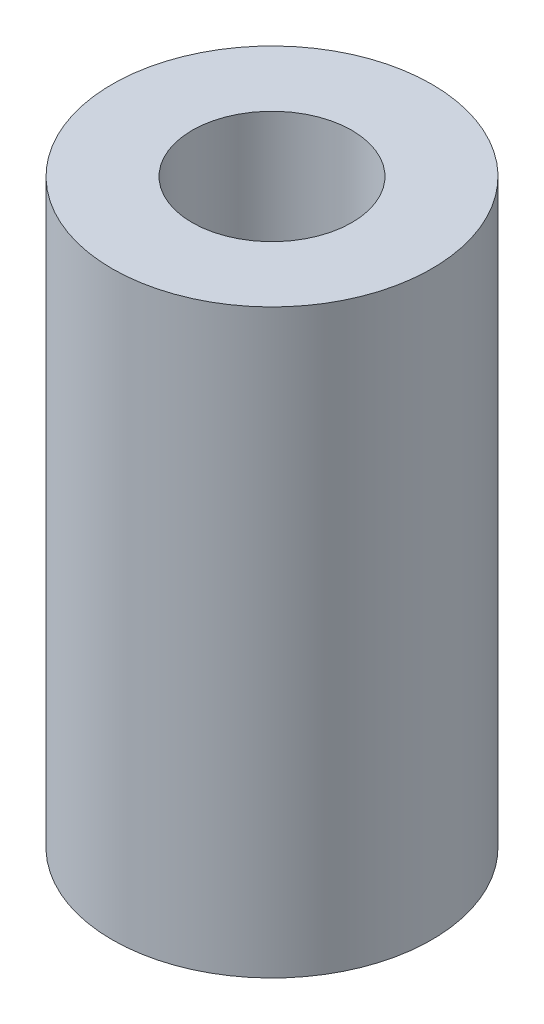
ISO-10303-21;
HEADER;
FILE_DESCRIPTION(('STEP AP214'),'2;1');
FILE_NAME('part.step','',(''),(''),'','','');
FILE_SCHEMA(('AUTOMOTIVE_DESIGN { 1 0 10303 214 1 1 1 1 }'));
ENDSEC;
DATA;
#1=APPLICATION_CONTEXT('core data for automotive mechanical design processes');
#2=APPLICATION_PROTOCOL_DEFINITION('international standard','automotive_design',2000,#1);
#3=PRODUCT_CONTEXT('',#1,'mechanical');
#4=PRODUCT('Part','Part','',(#3));
#5=PRODUCT_RELATED_PRODUCT_CATEGORY('part','',(#4));
#6=PRODUCT_DEFINITION_FORMATION('','',#4);
#7=PRODUCT_DEFINITION_CONTEXT('part definition',#1,'design');
#8=PRODUCT_DEFINITION('design','',#6,#7);
#9=PRODUCT_DEFINITION_SHAPE('','',#8);
#10=(LENGTH_UNIT() NAMED_UNIT(*) SI_UNIT(.MILLI.,.METRE.));
#11=(NAMED_UNIT(*) PLANE_ANGLE_UNIT() SI_UNIT($,.RADIAN.));
#12=(NAMED_UNIT(*) SI_UNIT($,.STERADIAN.) SOLID_ANGLE_UNIT());
#13=UNCERTAINTY_MEASURE_WITH_UNIT(LENGTH_MEASURE(1.E-05),#10,'distance_accuracy_value','');
#14=(GEOMETRIC_REPRESENTATION_CONTEXT(3) GLOBAL_UNCERTAINTY_ASSIGNED_CONTEXT((#13)) GLOBAL_UNIT_ASSIGNED_CONTEXT((#10,
#11,#12)) REPRESENTATION_CONTEXT('',''));
#15=CARTESIAN_POINT('',(0.,0.,0.));
#16=DIRECTION('',(0.,0.,1.));
#17=DIRECTION('',(1.,0.,0.));
#18=AXIS2_PLACEMENT_3D('',#15,#16,#17);
#19=CARTESIAN_POINT('',(0.,10.,0.));
#20=DIRECTION('',(0.,1.,0.));
#21=DIRECTION('',(0.,0.,1.));
#22=AXIS2_PLACEMENT_3D('',#19,#20,#21);
#23=PLANE('',#22);
#24=CARTESIAN_POINT('',(0.,10.,0.));
#25=DIRECTION('',(0.,1.,0.));
#26=DIRECTION('',(0.,0.,1.));
#27=AXIS2_PLACEMENT_3D('',#24,#25,#26);
#28=CIRCLE('',#27,2.75);
#29=CARTESIAN_POINT('',(0.,10.,2.75));
#30=VERTEX_POINT('',#29);
#31=EDGE_CURVE('E10',#30,#30,#28,.T.);
#32=ORIENTED_EDGE('',*,*,#31,.T.);
#33=EDGE_LOOP('',(#32));
#34=FACE_BOUND('',#33,.T.);
#35=CARTESIAN_POINT('',(0.,10.,0.));
#36=DIRECTION('',(0.,1.,0.));
#37=DIRECTION('',(0.,0.,1.));
#38=AXIS2_PLACEMENT_3D('',#35,#36,#37);
#39=CIRCLE('',#38,1.375);
#40=CARTESIAN_POINT('',(0.,10.,1.375));
#41=VERTEX_POINT('',#40);
#42=EDGE_CURVE('E50',#41,#41,#39,.T.);
#43=ORIENTED_EDGE('',*,*,#42,.F.);
#44=EDGE_LOOP('',(#43));
#45=FACE_BOUND('',#44,.T.);
#46=ADVANCED_FACE('F39',(#34,#45),#23,.T.);
#47=CARTESIAN_POINT('',(0.,0.,0.));
#48=DIRECTION('',(0.,1.,0.));
#49=DIRECTION('',(0.,0.,1.));
#50=AXIS2_PLACEMENT_3D('',#47,#48,#49);
#51=PLANE('',#50);
#52=CARTESIAN_POINT('',(0.,0.,0.));
#53=DIRECTION('',(0.,1.,0.));
#54=DIRECTION('',(0.,0.,1.));
#55=AXIS2_PLACEMENT_3D('',#52,#53,#54);
#56=CIRCLE('',#55,2.75);
#57=CARTESIAN_POINT('',(0.,0.,2.75));
#58=VERTEX_POINT('',#57);
#59=EDGE_CURVE('E43',#58,#58,#56,.T.);
#60=ORIENTED_EDGE('',*,*,#59,.F.);
#61=EDGE_LOOP('',(#60));
#62=FACE_BOUND('',#61,.T.);
#63=CARTESIAN_POINT('',(0.,0.,0.));
#64=DIRECTION('',(0.,1.,0.));
#65=DIRECTION('',(0.,0.,1.));
#66=AXIS2_PLACEMENT_3D('',#63,#64,#65);
#67=CIRCLE('',#66,1.375);
#68=CARTESIAN_POINT('',(0.,0.,1.375));
#69=VERTEX_POINT('',#68);
#70=EDGE_CURVE('E52',#69,#69,#67,.T.);
#71=ORIENTED_EDGE('',*,*,#70,.T.);
#72=EDGE_LOOP('',(#71));
#73=FACE_BOUND('',#72,.T.);
#74=ADVANCED_FACE('F62',(#62,#73),#51,.F.);
#75=CARTESIAN_POINT('',(0.,10.,0.));
#76=DIRECTION('',(0.,-1.,0.));
#77=DIRECTION('',(0.,0.,-1.));
#78=AXIS2_PLACEMENT_3D('',#75,#76,#77);
#79=CYLINDRICAL_SURFACE('',#78,2.75);
#80=ORIENTED_EDGE('',*,*,#31,.F.);
#81=EDGE_LOOP('',(#80));
#82=FACE_BOUND('',#81,.T.);
#83=ORIENTED_EDGE('',*,*,#59,.T.);
#84=EDGE_LOOP('',(#83));
#85=FACE_BOUND('',#84,.T.);
#86=ADVANCED_FACE('F41',(#82,#85),#79,.T.);
#87=CARTESIAN_POINT('',(0.,10.,0.));
#88=DIRECTION('',(0.,-1.,0.));
#89=DIRECTION('',(0.,0.,-1.));
#90=AXIS2_PLACEMENT_3D('',#87,#88,#89);
#91=CYLINDRICAL_SURFACE('',#90,1.375);
#92=ORIENTED_EDGE('',*,*,#42,.T.);
#93=EDGE_LOOP('',(#92));
#94=FACE_BOUND('',#93,.T.);
#95=ORIENTED_EDGE('',*,*,#70,.F.);
#96=EDGE_LOOP('',(#95));
#97=FACE_BOUND('',#96,.T.);
#98=ADVANCED_FACE('F58',(#94,#97),#91,.F.);
#99=CLOSED_SHELL('',(#46,#74,#86,#98));
#100=MANIFOLD_SOLID_BREP('B2',#99);
#101=ADVANCED_BREP_SHAPE_REPRESENTATION('',(#18,#100),#14);
#102=SHAPE_DEFINITION_REPRESENTATION(#9,#101);
ENDSEC;
END-ISO-10303-21;
